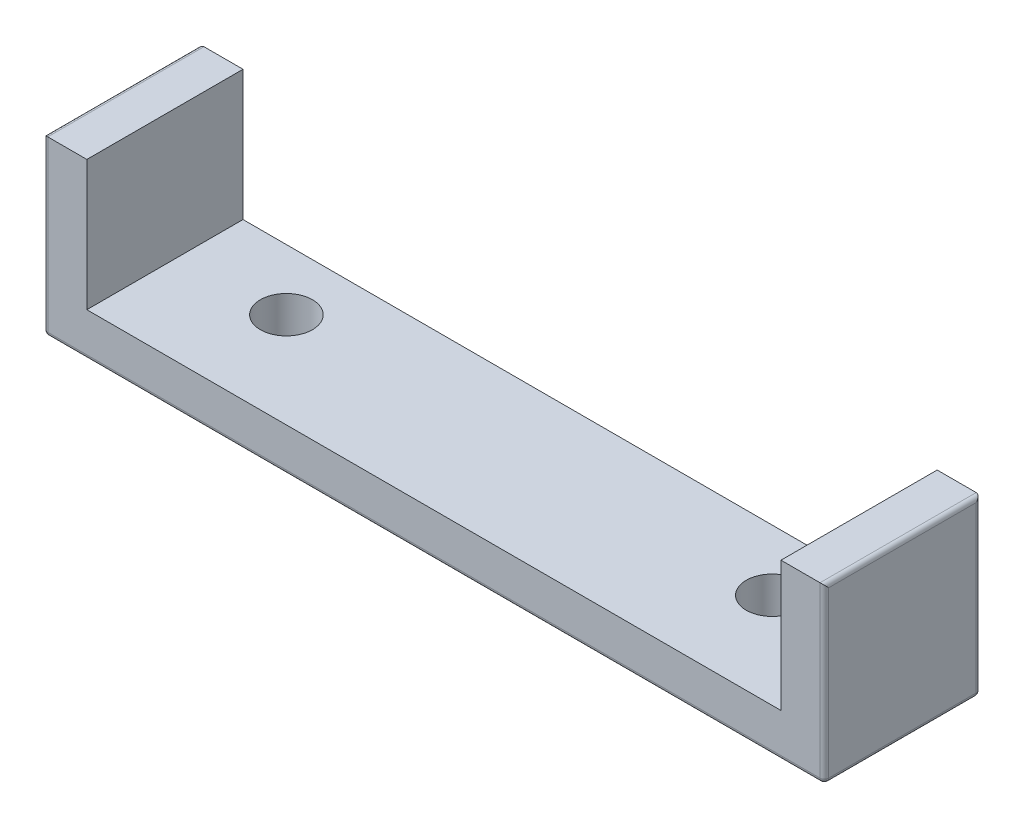
ISO-10303-21;
HEADER;
FILE_DESCRIPTION(('STEP AP214'),'2;1');
FILE_NAME('part.step','',(''),(''),'','','');
FILE_SCHEMA(('AUTOMOTIVE_DESIGN { 1 0 10303 214 1 1 1 1 }'));
ENDSEC;
DATA;
#1=APPLICATION_CONTEXT('core data for automotive mechanical design processes');
#2=APPLICATION_PROTOCOL_DEFINITION('international standard','automotive_design',2000,#1);
#3=PRODUCT_CONTEXT('',#1,'mechanical');
#4=PRODUCT('Part','Part','',(#3));
#5=PRODUCT_RELATED_PRODUCT_CATEGORY('part','',(#4));
#6=PRODUCT_DEFINITION_FORMATION('','',#4);
#7=PRODUCT_DEFINITION_CONTEXT('part definition',#1,'design');
#8=PRODUCT_DEFINITION('design','',#6,#7);
#9=PRODUCT_DEFINITION_SHAPE('','',#8);
#10=(LENGTH_UNIT() NAMED_UNIT(*) SI_UNIT(.MILLI.,.METRE.));
#11=(NAMED_UNIT(*) PLANE_ANGLE_UNIT() SI_UNIT($,.RADIAN.));
#12=(NAMED_UNIT(*) SI_UNIT($,.STERADIAN.) SOLID_ANGLE_UNIT());
#13=UNCERTAINTY_MEASURE_WITH_UNIT(LENGTH_MEASURE(1.E-05),#10,'distance_accuracy_value','');
#14=(GEOMETRIC_REPRESENTATION_CONTEXT(3) GLOBAL_UNCERTAINTY_ASSIGNED_CONTEXT((#13)) GLOBAL_UNIT_ASSIGNED_CONTEXT((#10,
#11,#12)) REPRESENTATION_CONTEXT('',''));
#15=CARTESIAN_POINT('',(0.,0.,0.));
#16=DIRECTION('',(0.,0.,1.));
#17=DIRECTION('',(1.,0.,0.));
#18=AXIS2_PLACEMENT_3D('',#15,#16,#17);
#19=CARTESIAN_POINT('',(0.,5.,0.));
#20=DIRECTION('',(0.,0.,-1.));
#21=DIRECTION('',(-1.,0.,0.));
#22=AXIS2_PLACEMENT_3D('',#19,#20,#21);
#23=PLANE('',#22);
#24=DIRECTION('',(1.,0.,0.));
#25=VECTOR('',#24,1.);
#26=CARTESIAN_POINT('',(57.5033,0.5,0.));
#27=LINE('',#26,#25);
#28=CARTESIAN_POINT('',(147.0033,0.5,0.));
#29=VERTEX_POINT('',#28);
#30=CARTESIAN_POINT('',(58.0033,0.5,0.));
#31=VERTEX_POINT('',#30);
#32=EDGE_CURVE('E200',#29,#31,#27,.F.);
#33=ORIENTED_EDGE('',*,*,#32,.T.);
#34=DIRECTION('',(0.,-1.,0.));
#35=VECTOR('',#34,1.);
#36=CARTESIAN_POINT('',(58.0033,20.,0.));
#37=LINE('',#36,#35);
#38=CARTESIAN_POINT('',(58.0033,20.,0.));
#39=VERTEX_POINT('',#38);
#40=EDGE_CURVE('E202',#31,#39,#37,.F.);
#41=ORIENTED_EDGE('',*,*,#40,.T.);
#42=DIRECTION('',(1.,0.,0.));
#43=VECTOR('',#42,1.);
#44=CARTESIAN_POINT('',(0.,20.,0.));
#45=LINE('',#44,#43);
#46=CARTESIAN_POINT('',(62.5033,20.,0.));
#47=VERTEX_POINT('',#46);
#48=EDGE_CURVE('E145',#39,#47,#45,.T.);
#49=ORIENTED_EDGE('',*,*,#48,.T.);
#50=DIRECTION('',(0.,-1.,0.));
#51=VECTOR('',#50,1.);
#52=CARTESIAN_POINT('',(62.5033,20.,0.));
#53=LINE('',#52,#51);
#54=CARTESIAN_POINT('',(62.5033,5.,0.));
#55=VERTEX_POINT('',#54);
#56=EDGE_CURVE('E171',#47,#55,#53,.T.);
#57=ORIENTED_EDGE('',*,*,#56,.T.);
#58=DIRECTION('',(1.,0.,0.));
#59=VECTOR('',#58,1.);
#60=CARTESIAN_POINT('',(0.,5.,0.));
#61=LINE('',#60,#59);
#62=CARTESIAN_POINT('',(142.5033,5.,0.));
#63=VERTEX_POINT('',#62);
#64=EDGE_CURVE('E141',#55,#63,#61,.T.);
#65=ORIENTED_EDGE('',*,*,#64,.T.);
#66=DIRECTION('',(0.,-1.,0.));
#67=VECTOR('',#66,1.);
#68=CARTESIAN_POINT('',(142.5033,20.,0.));
#69=LINE('',#68,#67);
#70=CARTESIAN_POINT('',(142.5033,20.,0.));
#71=VERTEX_POINT('',#70);
#72=EDGE_CURVE('E134',#71,#63,#69,.T.);
#73=ORIENTED_EDGE('',*,*,#72,.F.);
#74=DIRECTION('',(1.,0.,0.));
#75=VECTOR('',#74,1.);
#76=CARTESIAN_POINT('',(0.,20.,0.));
#77=LINE('',#76,#75);
#78=CARTESIAN_POINT('',(147.0033,20.,0.));
#79=VERTEX_POINT('',#78);
#80=EDGE_CURVE('E137',#71,#79,#77,.T.);
#81=ORIENTED_EDGE('',*,*,#80,.T.);
#82=DIRECTION('',(0.,-1.,0.));
#83=VECTOR('',#82,1.);
#84=CARTESIAN_POINT('',(147.0033,5.,0.));
#85=LINE('',#84,#83);
#86=EDGE_CURVE('E198',#79,#29,#85,.T.);
#87=ORIENTED_EDGE('',*,*,#86,.T.);
#88=EDGE_LOOP('',(#33,#41,#49,#57,#65,#73,#81,#87));
#89=FACE_BOUND('',#88,.T.);
#90=ADVANCED_FACE('F33',(#89),#23,.T.);
#91=CARTESIAN_POINT('',(0.,5.,18.));
#92=DIRECTION('',(0.,0.,-1.));
#93=DIRECTION('',(-1.,0.,0.));
#94=AXIS2_PLACEMENT_3D('',#91,#92,#93);
#95=PLANE('',#94);
#96=DIRECTION('',(1.,0.,0.));
#97=VECTOR('',#96,1.);
#98=CARTESIAN_POINT('',(0.,20.,18.));
#99=LINE('',#98,#97);
#100=CARTESIAN_POINT('',(58.0033,20.,18.));
#101=VERTEX_POINT('',#100);
#102=CARTESIAN_POINT('',(62.5033,20.,18.));
#103=VERTEX_POINT('',#102);
#104=EDGE_CURVE('E166',#101,#103,#99,.T.);
#105=ORIENTED_EDGE('',*,*,#104,.F.);
#106=DIRECTION('',(0.,-1.,0.));
#107=VECTOR('',#106,1.);
#108=CARTESIAN_POINT('',(58.0033,5.,18.));
#109=LINE('',#108,#107);
#110=CARTESIAN_POINT('',(58.0033,0.5,18.));
#111=VERTEX_POINT('',#110);
#112=EDGE_CURVE('E211',#101,#111,#109,.T.);
#113=ORIENTED_EDGE('',*,*,#112,.T.);
#114=DIRECTION('',(1.,0.,0.));
#115=VECTOR('',#114,1.);
#116=CARTESIAN_POINT('',(0.,0.5,18.));
#117=LINE('',#116,#115);
#118=CARTESIAN_POINT('',(147.0033,0.5,18.));
#119=VERTEX_POINT('',#118);
#120=EDGE_CURVE('E209',#111,#119,#117,.T.);
#121=ORIENTED_EDGE('',*,*,#120,.T.);
#122=DIRECTION('',(0.,-1.,0.));
#123=VECTOR('',#122,1.);
#124=CARTESIAN_POINT('',(147.0033,20.,18.));
#125=LINE('',#124,#123);
#126=CARTESIAN_POINT('',(147.0033,20.,18.));
#127=VERTEX_POINT('',#126);
#128=EDGE_CURVE('E207',#119,#127,#125,.F.);
#129=ORIENTED_EDGE('',*,*,#128,.T.);
#130=DIRECTION('',(1.,0.,0.));
#131=VECTOR('',#130,1.);
#132=CARTESIAN_POINT('',(0.,20.,18.));
#133=LINE('',#132,#131);
#134=CARTESIAN_POINT('',(142.5033,20.,18.));
#135=VERTEX_POINT('',#134);
#136=EDGE_CURVE('E155',#135,#127,#133,.T.);
#137=ORIENTED_EDGE('',*,*,#136,.F.);
#138=DIRECTION('',(0.,-1.,0.));
#139=VECTOR('',#138,1.);
#140=CARTESIAN_POINT('',(142.5033,20.,18.));
#141=LINE('',#140,#139);
#142=CARTESIAN_POINT('',(142.5033,5.,18.));
#143=VERTEX_POINT('',#142);
#144=EDGE_CURVE('E146',#135,#143,#141,.T.);
#145=ORIENTED_EDGE('',*,*,#144,.T.);
#146=DIRECTION('',(1.,0.,0.));
#147=VECTOR('',#146,1.);
#148=CARTESIAN_POINT('',(0.,5.,18.));
#149=LINE('',#148,#147);
#150=CARTESIAN_POINT('',(62.5033,5.,18.));
#151=VERTEX_POINT('',#150);
#152=EDGE_CURVE('E185',#151,#143,#149,.T.);
#153=ORIENTED_EDGE('',*,*,#152,.F.);
#154=DIRECTION('',(0.,-1.,0.));
#155=VECTOR('',#154,1.);
#156=CARTESIAN_POINT('',(62.5033,20.,18.));
#157=LINE('',#156,#155);
#158=EDGE_CURVE('E173',#103,#151,#157,.T.);
#159=ORIENTED_EDGE('',*,*,#158,.F.);
#160=EDGE_LOOP('',(#105,#113,#121,#129,#137,#145,#153,#159));
#161=FACE_BOUND('',#160,.T.);
#162=ADVANCED_FACE('F320',(#161),#95,.F.);
#163=CARTESIAN_POINT('',(74.5033,5.,7.));
#164=DIRECTION('',(0.,-1.,0.));
#165=DIRECTION('',(0.,0.,-1.));
#166=AXIS2_PLACEMENT_3D('',#163,#164,#165);
#167=CYLINDRICAL_SURFACE('',#166,3.00000000000001);
#168=CARTESIAN_POINT('',(74.5033,0.5,7.));
#169=DIRECTION('',(0.,1.,0.));
#170=DIRECTION('',(0.,0.,1.));
#171=AXIS2_PLACEMENT_3D('',#168,#169,#170);
#172=CIRCLE('',#171,3.00000000000001);
#173=CARTESIAN_POINT('',(74.5033,0.5,10.));
#174=VERTEX_POINT('',#173);
#175=EDGE_CURVE('E228',#174,#174,#172,.F.);
#176=ORIENTED_EDGE('',*,*,#175,.T.);
#177=EDGE_LOOP('',(#176));
#178=FACE_BOUND('',#177,.T.);
#179=CARTESIAN_POINT('',(74.5033,5.,7.));
#180=DIRECTION('',(0.,1.,0.));
#181=DIRECTION('',(0.,0.,1.));
#182=AXIS2_PLACEMENT_3D('',#179,#180,#181);
#183=CIRCLE('',#182,3.00000000000001);
#184=CARTESIAN_POINT('',(74.5033,5.,10.));
#185=VERTEX_POINT('',#184);
#186=EDGE_CURVE('E178',#185,#185,#183,.T.);
#187=ORIENTED_EDGE('',*,*,#186,.T.);
#188=EDGE_LOOP('',(#187));
#189=FACE_BOUND('',#188,.T.);
#190=ADVANCED_FACE('F363',(#178,#189),#167,.F.);
#191=CARTESIAN_POINT('',(130.5033,5.,7.));
#192=DIRECTION('',(0.,-1.,0.));
#193=DIRECTION('',(0.,0.,-1.));
#194=AXIS2_PLACEMENT_3D('',#191,#192,#193);
#195=CYLINDRICAL_SURFACE('',#194,2.99999999999999);
#196=CARTESIAN_POINT('',(130.5033,0.5,7.));
#197=DIRECTION('',(0.,1.,0.));
#198=DIRECTION('',(0.,0.,1.));
#199=AXIS2_PLACEMENT_3D('',#196,#197,#198);
#200=CIRCLE('',#199,2.99999999999999);
#201=CARTESIAN_POINT('',(130.5033,0.5,9.99999999999999));
#202=VERTEX_POINT('',#201);
#203=EDGE_CURVE('E231',#202,#202,#200,.F.);
#204=ORIENTED_EDGE('',*,*,#203,.T.);
#205=EDGE_LOOP('',(#204));
#206=FACE_BOUND('',#205,.T.);
#207=CARTESIAN_POINT('',(130.5033,5.,7.));
#208=DIRECTION('',(0.,1.,0.));
#209=DIRECTION('',(0.,0.,1.));
#210=AXIS2_PLACEMENT_3D('',#207,#208,#209);
#211=CIRCLE('',#210,2.99999999999999);
#212=CARTESIAN_POINT('',(130.5033,5.,9.99999999999999));
#213=VERTEX_POINT('',#212);
#214=EDGE_CURVE('E175',#213,#213,#211,.T.);
#215=ORIENTED_EDGE('',*,*,#214,.T.);
#216=EDGE_LOOP('',(#215));
#217=FACE_BOUND('',#216,.T.);
#218=ADVANCED_FACE('F369',(#206,#217),#195,.F.);
#219=CARTESIAN_POINT('',(0.,5.,0.));
#220=DIRECTION('',(0.,1.,0.));
#221=DIRECTION('',(0.,0.,1.));
#222=AXIS2_PLACEMENT_3D('',#219,#220,#221);
#223=PLANE('',#222);
#224=ORIENTED_EDGE('',*,*,#214,.F.);
#225=EDGE_LOOP('',(#224));
#226=FACE_BOUND('',#225,.T.);
#227=ORIENTED_EDGE('',*,*,#186,.F.);
#228=EDGE_LOOP('',(#227));
#229=FACE_BOUND('',#228,.T.);
#230=ORIENTED_EDGE('',*,*,#64,.F.);
#231=DIRECTION('',(0.,0.,1.));
#232=VECTOR('',#231,1.);
#233=CARTESIAN_POINT('',(62.5033,5.,0.));
#234=LINE('',#233,#232);
#235=EDGE_CURVE('E182',#55,#151,#234,.T.);
#236=ORIENTED_EDGE('',*,*,#235,.T.);
#237=ORIENTED_EDGE('',*,*,#152,.T.);
#238=DIRECTION('',(0.,0.,1.));
#239=VECTOR('',#238,1.);
#240=CARTESIAN_POINT('',(142.5033,5.,0.));
#241=LINE('',#240,#239);
#242=EDGE_CURVE('E187',#63,#143,#241,.T.);
#243=ORIENTED_EDGE('',*,*,#242,.F.);
#244=EDGE_LOOP('',(#230,#236,#237,#243));
#245=FACE_BOUND('',#244,.T.);
#246=ADVANCED_FACE('F318',(#226,#229,#245),#223,.T.);
#247=CARTESIAN_POINT('',(0.,0.,0.));
#248=DIRECTION('',(0.,1.,0.));
#249=DIRECTION('',(0.,0.,1.));
#250=AXIS2_PLACEMENT_3D('',#247,#248,#249);
#251=PLANE('',#250);
#252=CARTESIAN_POINT('',(74.5033,0.,7.));
#253=DIRECTION('',(0.,1.,0.));
#254=DIRECTION('',(0.,0.,1.));
#255=AXIS2_PLACEMENT_3D('',#252,#253,#254);
#256=CIRCLE('',#255,3.50000000000001);
#257=CARTESIAN_POINT('',(74.5033,0.,10.5));
#258=VERTEX_POINT('',#257);
#259=EDGE_CURVE('E225',#258,#258,#256,.T.);
#260=ORIENTED_EDGE('',*,*,#259,.T.);
#261=EDGE_LOOP('',(#260));
#262=FACE_BOUND('',#261,.T.);
#263=CARTESIAN_POINT('',(130.5033,0.,7.));
#264=DIRECTION('',(0.,1.,0.));
#265=DIRECTION('',(0.,0.,1.));
#266=AXIS2_PLACEMENT_3D('',#263,#264,#265);
#267=CIRCLE('',#266,3.49999999999999);
#268=CARTESIAN_POINT('',(130.5033,0.,10.5));
#269=VERTEX_POINT('',#268);
#270=EDGE_CURVE('E222',#269,#269,#267,.T.);
#271=ORIENTED_EDGE('',*,*,#270,.T.);
#272=EDGE_LOOP('',(#271));
#273=FACE_BOUND('',#272,.T.);
#274=DIRECTION('',(1.,0.,0.));
#275=VECTOR('',#274,1.);
#276=CARTESIAN_POINT('',(0.,0.,17.5));
#277=LINE('',#276,#275);
#278=CARTESIAN_POINT('',(147.0033,0.,17.5));
#279=VERTEX_POINT('',#278);
#280=CARTESIAN_POINT('',(58.0033,0.,17.5));
#281=VERTEX_POINT('',#280);
#282=EDGE_CURVE('E217',#279,#281,#277,.F.);
#283=ORIENTED_EDGE('',*,*,#282,.T.);
#284=DIRECTION('',(0.,0.,1.));
#285=VECTOR('',#284,1.);
#286=CARTESIAN_POINT('',(58.0033,0.,0.));
#287=LINE('',#286,#285);
#288=CARTESIAN_POINT('',(58.0033,0.,0.5));
#289=VERTEX_POINT('',#288);
#290=EDGE_CURVE('E219',#281,#289,#287,.F.);
#291=ORIENTED_EDGE('',*,*,#290,.T.);
#292=DIRECTION('',(1.,0.,0.));
#293=VECTOR('',#292,1.);
#294=CARTESIAN_POINT('',(147.5033,0.,0.5));
#295=LINE('',#294,#293);
#296=CARTESIAN_POINT('',(147.0033,0.,0.5));
#297=VERTEX_POINT('',#296);
#298=EDGE_CURVE('E215',#289,#297,#295,.T.);
#299=ORIENTED_EDGE('',*,*,#298,.T.);
#300=DIRECTION('',(0.,0.,1.));
#301=VECTOR('',#300,1.);
#302=CARTESIAN_POINT('',(147.0033,0.,18.));
#303=LINE('',#302,#301);
#304=EDGE_CURVE('E213',#297,#279,#303,.T.);
#305=ORIENTED_EDGE('',*,*,#304,.T.);
#306=EDGE_LOOP('',(#283,#291,#299,#305));
#307=FACE_BOUND('',#306,.T.);
#308=ADVANCED_FACE('F347',(#262,#273,#307),#251,.F.);
#309=CARTESIAN_POINT('',(62.5033,20.,0.));
#310=DIRECTION('',(1.,0.,0.));
#311=DIRECTION('',(0.,0.,-1.));
#312=AXIS2_PLACEMENT_3D('',#309,#310,#311);
#313=PLANE('',#312);
#314=ORIENTED_EDGE('',*,*,#235,.F.);
#315=ORIENTED_EDGE('',*,*,#56,.F.);
#316=DIRECTION('',(0.,0.,1.));
#317=VECTOR('',#316,1.);
#318=CARTESIAN_POINT('',(62.5033,20.,0.));
#319=LINE('',#318,#317);
#320=EDGE_CURVE('E168',#47,#103,#319,.T.);
#321=ORIENTED_EDGE('',*,*,#320,.T.);
#322=ORIENTED_EDGE('',*,*,#158,.T.);
#323=EDGE_LOOP('',(#314,#315,#321,#322));
#324=FACE_BOUND('',#323,.T.);
#325=ADVANCED_FACE('F315',(#324),#313,.T.);
#326=CARTESIAN_POINT('',(57.5033,20.,0.));
#327=DIRECTION('',(1.,0.,0.));
#328=DIRECTION('',(0.,0.,-1.));
#329=AXIS2_PLACEMENT_3D('',#326,#327,#328);
#330=PLANE('',#329);
#331=DIRECTION('',(0.,0.,1.));
#332=VECTOR('',#331,1.);
#333=CARTESIAN_POINT('',(57.5033,19.5,0.));
#334=LINE('',#333,#332);
#335=CARTESIAN_POINT('',(57.5033,19.5,17.5));
#336=VERTEX_POINT('',#335);
#337=CARTESIAN_POINT('',(57.5033,19.5,0.5));
#338=VERTEX_POINT('',#337);
#339=EDGE_CURVE('E193',#336,#338,#334,.F.);
#340=ORIENTED_EDGE('',*,*,#339,.T.);
#341=DIRECTION('',(0.,-1.,0.));
#342=VECTOR('',#341,1.);
#343=CARTESIAN_POINT('',(57.5033,0.,0.5));
#344=LINE('',#343,#342);
#345=CARTESIAN_POINT('',(57.5033,0.5,0.5));
#346=VERTEX_POINT('',#345);
#347=EDGE_CURVE('E195',#338,#346,#344,.T.);
#348=ORIENTED_EDGE('',*,*,#347,.T.);
#349=DIRECTION('',(0.,0.,1.));
#350=VECTOR('',#349,1.);
#351=CARTESIAN_POINT('',(57.5033,0.5,0.));
#352=LINE('',#351,#350);
#353=CARTESIAN_POINT('',(57.5033,0.5,17.5));
#354=VERTEX_POINT('',#353);
#355=EDGE_CURVE('E189',#346,#354,#352,.T.);
#356=ORIENTED_EDGE('',*,*,#355,.T.);
#357=DIRECTION('',(0.,-1.,0.));
#358=VECTOR('',#357,1.);
#359=CARTESIAN_POINT('',(57.5033,20.,17.5));
#360=LINE('',#359,#358);
#361=EDGE_CURVE('E191',#354,#336,#360,.F.);
#362=ORIENTED_EDGE('',*,*,#361,.T.);
#363=EDGE_LOOP('',(#340,#348,#356,#362));
#364=FACE_BOUND('',#363,.T.);
#365=ADVANCED_FACE('F339',(#364),#330,.F.);
#366=CARTESIAN_POINT('',(0.,20.,0.));
#367=DIRECTION('',(0.,1.,0.));
#368=DIRECTION('',(0.,0.,1.));
#369=AXIS2_PLACEMENT_3D('',#366,#367,#368);
#370=PLANE('',#369);
#371=ORIENTED_EDGE('',*,*,#48,.F.);
#372=DIRECTION('',(0.,0.,1.));
#373=VECTOR('',#372,1.);
#374=CARTESIAN_POINT('',(58.0033,20.,18.));
#375=LINE('',#374,#373);
#376=EDGE_CURVE('E205',#39,#101,#375,.T.);
#377=ORIENTED_EDGE('',*,*,#376,.T.);
#378=ORIENTED_EDGE('',*,*,#104,.T.);
#379=ORIENTED_EDGE('',*,*,#320,.F.);
#380=EDGE_LOOP('',(#371,#377,#378,#379));
#381=FACE_BOUND('',#380,.T.);
#382=ADVANCED_FACE('F310',(#381),#370,.T.);
#383=CARTESIAN_POINT('',(142.5033,20.,0.));
#384=DIRECTION('',(1.,0.,0.));
#385=DIRECTION('',(0.,0.,-1.));
#386=AXIS2_PLACEMENT_3D('',#383,#384,#385);
#387=PLANE('',#386);
#388=ORIENTED_EDGE('',*,*,#72,.T.);
#389=ORIENTED_EDGE('',*,*,#242,.T.);
#390=ORIENTED_EDGE('',*,*,#144,.F.);
#391=DIRECTION('',(0.,0.,1.));
#392=VECTOR('',#391,1.);
#393=CARTESIAN_POINT('',(142.5033,20.,0.));
#394=LINE('',#393,#392);
#395=EDGE_CURVE('E149',#71,#135,#394,.T.);
#396=ORIENTED_EDGE('',*,*,#395,.F.);
#397=EDGE_LOOP('',(#388,#389,#390,#396));
#398=FACE_BOUND('',#397,.T.);
#399=ADVANCED_FACE('F150',(#398),#387,.F.);
#400=CARTESIAN_POINT('',(147.5033,20.,0.));
#401=DIRECTION('',(1.,0.,0.));
#402=DIRECTION('',(0.,0.,-1.));
#403=AXIS2_PLACEMENT_3D('',#400,#401,#402);
#404=PLANE('',#403);
#405=DIRECTION('',(0.,0.,1.));
#406=VECTOR('',#405,1.);
#407=CARTESIAN_POINT('',(147.5033,19.5,0.));
#408=LINE('',#407,#406);
#409=CARTESIAN_POINT('',(147.5033,19.5,0.5));
#410=VERTEX_POINT('',#409);
#411=CARTESIAN_POINT('',(147.5033,19.5,17.5));
#412=VERTEX_POINT('',#411);
#413=EDGE_CURVE('E50',#410,#412,#408,.T.);
#414=ORIENTED_EDGE('',*,*,#413,.T.);
#415=DIRECTION('',(0.,-1.,0.));
#416=VECTOR('',#415,1.);
#417=CARTESIAN_POINT('',(147.5033,0.,17.5));
#418=LINE('',#417,#416);
#419=CARTESIAN_POINT('',(147.5033,0.5,17.5));
#420=VERTEX_POINT('',#419);
#421=EDGE_CURVE('E42',#412,#420,#418,.T.);
#422=ORIENTED_EDGE('',*,*,#421,.T.);
#423=DIRECTION('',(0.,0.,1.));
#424=VECTOR('',#423,1.);
#425=CARTESIAN_POINT('',(147.5033,0.5,0.));
#426=LINE('',#425,#424);
#427=CARTESIAN_POINT('',(147.5033,0.5,0.5));
#428=VERTEX_POINT('',#427);
#429=EDGE_CURVE('E234',#420,#428,#426,.F.);
#430=ORIENTED_EDGE('',*,*,#429,.T.);
#431=DIRECTION('',(0.,-1.,0.));
#432=VECTOR('',#431,1.);
#433=CARTESIAN_POINT('',(147.5033,20.,0.5));
#434=LINE('',#433,#432);
#435=EDGE_CURVE('E55',#428,#410,#434,.F.);
#436=ORIENTED_EDGE('',*,*,#435,.T.);
#437=EDGE_LOOP('',(#414,#422,#430,#436));
#438=FACE_BOUND('',#437,.T.);
#439=ADVANCED_FACE('F285',(#438),#404,.T.);
#440=CARTESIAN_POINT('',(0.,20.,0.));
#441=DIRECTION('',(0.,1.,0.));
#442=DIRECTION('',(0.,0.,1.));
#443=AXIS2_PLACEMENT_3D('',#440,#441,#442);
#444=PLANE('',#443);
#445=ORIENTED_EDGE('',*,*,#136,.T.);
#446=DIRECTION('',(0.,0.,1.));
#447=VECTOR('',#446,1.);
#448=CARTESIAN_POINT('',(147.0033,20.,0.));
#449=LINE('',#448,#447);
#450=EDGE_CURVE('E11',#127,#79,#449,.F.);
#451=ORIENTED_EDGE('',*,*,#450,.T.);
#452=ORIENTED_EDGE('',*,*,#80,.F.);
#453=ORIENTED_EDGE('',*,*,#395,.T.);
#454=EDGE_LOOP('',(#445,#451,#452,#453));
#455=FACE_BOUND('',#454,.T.);
#456=ADVANCED_FACE('F157',(#455),#444,.T.);
#457=CARTESIAN_POINT('',(147.0033,20.,17.5));
#458=DIRECTION('',(0.,1.,0.));
#459=DIRECTION('',(0.,0.,1.));
#460=AXIS2_PLACEMENT_3D('',#457,#458,#459);
#461=CYLINDRICAL_SURFACE('',#460,0.5);
#462=CARTESIAN_POINT('',(147.0033,0.5,17.5));
#463=DIRECTION('',(0.,-1.,0.));
#464=DIRECTION('',(0.,0.,-1.));
#465=AXIS2_PLACEMENT_3D('',#462,#463,#464);
#466=CIRCLE('',#465,0.5);
#467=EDGE_CURVE('E37',#420,#119,#466,.T.);
#468=ORIENTED_EDGE('',*,*,#467,.F.);
#469=ORIENTED_EDGE('',*,*,#421,.F.);
#470=CARTESIAN_POINT('',(147.0033,19.5,17.5));
#471=DIRECTION('',(0.,-0.707106781186547,0.707106781186547));
#472=DIRECTION('',(0.,0.707106781186547,0.707106781186547));
#473=AXIS2_PLACEMENT_3D('',#470,#471,#472);
#474=ELLIPSE('',#473,0.707106781186547,0.5);
#475=EDGE_CURVE('E161',#127,#412,#474,.F.);
#476=ORIENTED_EDGE('',*,*,#475,.F.);
#477=ORIENTED_EDGE('',*,*,#128,.F.);
#478=EDGE_LOOP('',(#468,#469,#476,#477));
#479=FACE_BOUND('',#478,.T.);
#480=ADVANCED_FACE('F284',(#479),#461,.T.);
#481=CARTESIAN_POINT('',(147.0033,0.5,17.5));
#482=DIRECTION('',(0.,0.,1.));
#483=DIRECTION('',(1.,0.,0.));
#484=AXIS2_PLACEMENT_3D('',#481,#482,#483);
#485=SPHERICAL_SURFACE('',#484,0.5);
#486=CARTESIAN_POINT('',(147.0033,0.5,17.5));
#487=DIRECTION('',(0.,0.,1.));
#488=DIRECTION('',(1.,0.,0.));
#489=AXIS2_PLACEMENT_3D('',#486,#487,#488);
#490=CIRCLE('',#489,0.5);
#491=EDGE_CURVE('E272',#420,#279,#490,.F.);
#492=ORIENTED_EDGE('',*,*,#491,.F.);
#493=ORIENTED_EDGE('',*,*,#467,.T.);
#494=CARTESIAN_POINT('',(147.0033,0.5,17.5));
#495=DIRECTION('',(1.,0.,0.));
#496=DIRECTION('',(0.,0.,-1.));
#497=AXIS2_PLACEMENT_3D('',#494,#495,#496);
#498=CIRCLE('',#497,0.5);
#499=EDGE_CURVE('E275',#279,#119,#498,.F.);
#500=ORIENTED_EDGE('',*,*,#499,.F.);
#501=EDGE_LOOP('',(#492,#493,#500));
#502=FACE_BOUND('',#501,.T.);
#503=ADVANCED_FACE('F349',(#502),#485,.T.);
#504=CARTESIAN_POINT('',(147.0033,19.5,0.));
#505=DIRECTION('',(0.,0.,1.));
#506=DIRECTION('',(1.,0.,0.));
#507=AXIS2_PLACEMENT_3D('',#504,#505,#506);
#508=CYLINDRICAL_SURFACE('',#507,0.5);
#509=ORIENTED_EDGE('',*,*,#475,.T.);
#510=ORIENTED_EDGE('',*,*,#413,.F.);
#511=CARTESIAN_POINT('',(147.0033,19.5,0.5));
#512=DIRECTION('',(0.,-0.707106781186547,-0.707106781186547));
#513=DIRECTION('',(0.,-0.707106781186547,0.707106781186547));
#514=AXIS2_PLACEMENT_3D('',#511,#512,#513);
#515=ELLIPSE('',#514,0.707106781186547,0.5);
#516=EDGE_CURVE('E269',#79,#410,#515,.T.);
#517=ORIENTED_EDGE('',*,*,#516,.F.);
#518=ORIENTED_EDGE('',*,*,#450,.F.);
#519=EDGE_LOOP('',(#509,#510,#517,#518));
#520=FACE_BOUND('',#519,.T.);
#521=ADVANCED_FACE('F280',(#520),#508,.T.);
#522=CARTESIAN_POINT('',(0.,0.5,17.5));
#523=DIRECTION('',(1.,0.,0.));
#524=DIRECTION('',(0.,0.,-1.));
#525=AXIS2_PLACEMENT_3D('',#522,#523,#524);
#526=CYLINDRICAL_SURFACE('',#525,0.5);
#527=ORIENTED_EDGE('',*,*,#499,.T.);
#528=ORIENTED_EDGE('',*,*,#120,.F.);
#529=CARTESIAN_POINT('',(58.0033,0.5,17.5));
#530=DIRECTION('',(-1.,0.,0.));
#531=DIRECTION('',(0.,0.,1.));
#532=AXIS2_PLACEMENT_3D('',#529,#530,#531);
#533=CIRCLE('',#532,0.5);
#534=EDGE_CURVE('E266',#281,#111,#533,.T.);
#535=ORIENTED_EDGE('',*,*,#534,.F.);
#536=ORIENTED_EDGE('',*,*,#282,.F.);
#537=EDGE_LOOP('',(#527,#528,#535,#536));
#538=FACE_BOUND('',#537,.T.);
#539=ADVANCED_FACE('F325',(#538),#526,.T.);
#540=CARTESIAN_POINT('',(147.0033,0.5,0.));
#541=DIRECTION('',(0.,0.,-1.));
#542=DIRECTION('',(-1.,0.,0.));
#543=AXIS2_PLACEMENT_3D('',#540,#541,#542);
#544=CYLINDRICAL_SURFACE('',#543,0.5);
#545=ORIENTED_EDGE('',*,*,#491,.T.);
#546=ORIENTED_EDGE('',*,*,#304,.F.);
#547=CARTESIAN_POINT('',(147.0033,0.5,0.5));
#548=DIRECTION('',(0.,0.,-1.));
#549=DIRECTION('',(-1.,0.,0.));
#550=AXIS2_PLACEMENT_3D('',#547,#548,#549);
#551=CIRCLE('',#550,0.5);
#552=EDGE_CURVE('E263',#428,#297,#551,.T.);
#553=ORIENTED_EDGE('',*,*,#552,.F.);
#554=ORIENTED_EDGE('',*,*,#429,.F.);
#555=EDGE_LOOP('',(#545,#546,#553,#554));
#556=FACE_BOUND('',#555,.T.);
#557=ADVANCED_FACE('F295',(#556),#544,.T.);
#558=CARTESIAN_POINT('',(147.0033,5.,0.5));
#559=DIRECTION('',(0.,-1.,0.));
#560=DIRECTION('',(0.,0.,-1.));
#561=AXIS2_PLACEMENT_3D('',#558,#559,#560);
#562=CYLINDRICAL_SURFACE('',#561,0.5);
#563=ORIENTED_EDGE('',*,*,#516,.T.);
#564=ORIENTED_EDGE('',*,*,#435,.F.);
#565=CARTESIAN_POINT('',(147.0033,0.5,0.5));
#566=DIRECTION('',(0.,-1.,0.));
#567=DIRECTION('',(0.,0.,-1.));
#568=AXIS2_PLACEMENT_3D('',#565,#566,#567);
#569=CIRCLE('',#568,0.5);
#570=EDGE_CURVE('E260',#29,#428,#569,.T.);
#571=ORIENTED_EDGE('',*,*,#570,.F.);
#572=ORIENTED_EDGE('',*,*,#86,.F.);
#573=EDGE_LOOP('',(#563,#564,#571,#572));
#574=FACE_BOUND('',#573,.T.);
#575=ADVANCED_FACE('F291',(#574),#562,.T.);
#576=CARTESIAN_POINT('',(58.0033,0.5,17.5));
#577=DIRECTION('',(0.,0.,1.));
#578=DIRECTION('',(1.,0.,0.));
#579=AXIS2_PLACEMENT_3D('',#576,#577,#578);
#580=SPHERICAL_SURFACE('',#579,0.5);
#581=CARTESIAN_POINT('',(58.0033,0.5,17.5));
#582=DIRECTION('',(0.,0.,1.));
#583=DIRECTION('',(1.,0.,0.));
#584=AXIS2_PLACEMENT_3D('',#581,#582,#583);
#585=CIRCLE('',#584,0.5);
#586=EDGE_CURVE('E254',#281,#354,#585,.F.);
#587=ORIENTED_EDGE('',*,*,#586,.F.);
#588=ORIENTED_EDGE('',*,*,#534,.T.);
#589=CARTESIAN_POINT('',(58.0033,0.5,17.5));
#590=DIRECTION('',(0.,-1.,0.));
#591=DIRECTION('',(1.,0.,0.));
#592=AXIS2_PLACEMENT_3D('',#589,#590,#591);
#593=CIRCLE('',#592,0.5);
#594=EDGE_CURVE('E257',#354,#111,#593,.F.);
#595=ORIENTED_EDGE('',*,*,#594,.F.);
#596=EDGE_LOOP('',(#587,#588,#595));
#597=FACE_BOUND('',#596,.T.);
#598=ADVANCED_FACE('F331',(#597),#580,.T.);
#599=CARTESIAN_POINT('',(147.0033,0.5,0.5));
#600=DIRECTION('',(0.,0.,1.));
#601=DIRECTION('',(1.,0.,0.));
#602=AXIS2_PLACEMENT_3D('',#599,#600,#601);
#603=SPHERICAL_SURFACE('',#602,0.5);
#604=ORIENTED_EDGE('',*,*,#570,.T.);
#605=ORIENTED_EDGE('',*,*,#552,.T.);
#606=CARTESIAN_POINT('',(147.0033,0.5,0.5));
#607=DIRECTION('',(1.,0.,0.));
#608=DIRECTION('',(0.,0.,-1.));
#609=AXIS2_PLACEMENT_3D('',#606,#607,#608);
#610=CIRCLE('',#609,0.5);
#611=EDGE_CURVE('E251',#29,#297,#610,.F.);
#612=ORIENTED_EDGE('',*,*,#611,.F.);
#613=EDGE_LOOP('',(#604,#605,#612));
#614=FACE_BOUND('',#613,.T.);
#615=ADVANCED_FACE('F297',(#614),#603,.T.);
#616=CARTESIAN_POINT('',(58.0033,5.,17.5));
#617=DIRECTION('',(0.,-1.,0.));
#618=DIRECTION('',(0.,0.,-1.));
#619=AXIS2_PLACEMENT_3D('',#616,#617,#618);
#620=CYLINDRICAL_SURFACE('',#619,0.5);
#621=ORIENTED_EDGE('',*,*,#594,.T.);
#622=ORIENTED_EDGE('',*,*,#112,.F.);
#623=CARTESIAN_POINT('',(58.0033,19.5,17.5));
#624=DIRECTION('',(0.,-0.707106781186547,0.707106781186547));
#625=DIRECTION('',(0.,-0.707106781186547,-0.707106781186547));
#626=AXIS2_PLACEMENT_3D('',#623,#624,#625);
#627=ELLIPSE('',#626,0.707106781186547,0.5);
#628=EDGE_CURVE('E248',#336,#101,#627,.F.);
#629=ORIENTED_EDGE('',*,*,#628,.F.);
#630=ORIENTED_EDGE('',*,*,#361,.F.);
#631=EDGE_LOOP('',(#621,#622,#629,#630));
#632=FACE_BOUND('',#631,.T.);
#633=ADVANCED_FACE('F335',(#632),#620,.T.);
#634=CARTESIAN_POINT('',(58.0033,0.5,0.));
#635=DIRECTION('',(0.,0.,1.));
#636=DIRECTION('',(1.,0.,0.));
#637=AXIS2_PLACEMENT_3D('',#634,#635,#636);
#638=CYLINDRICAL_SURFACE('',#637,0.5);
#639=ORIENTED_EDGE('',*,*,#586,.T.);
#640=ORIENTED_EDGE('',*,*,#355,.F.);
#641=CARTESIAN_POINT('',(58.0033,0.5,0.5));
#642=DIRECTION('',(0.,0.,-1.));
#643=DIRECTION('',(-1.,0.,0.));
#644=AXIS2_PLACEMENT_3D('',#641,#642,#643);
#645=CIRCLE('',#644,0.5);
#646=EDGE_CURVE('E245',#289,#346,#645,.T.);
#647=ORIENTED_EDGE('',*,*,#646,.F.);
#648=ORIENTED_EDGE('',*,*,#290,.F.);
#649=EDGE_LOOP('',(#639,#640,#647,#648));
#650=FACE_BOUND('',#649,.T.);
#651=ADVANCED_FACE('F345',(#650),#638,.T.);
#652=CARTESIAN_POINT('',(0.,0.5,0.5));
#653=DIRECTION('',(-1.,0.,0.));
#654=DIRECTION('',(0.,0.,1.));
#655=AXIS2_PLACEMENT_3D('',#652,#653,#654);
#656=CYLINDRICAL_SURFACE('',#655,0.5);
#657=ORIENTED_EDGE('',*,*,#611,.T.);
#658=ORIENTED_EDGE('',*,*,#298,.F.);
#659=CARTESIAN_POINT('',(58.0033,0.5,0.5));
#660=DIRECTION('',(-1.,0.,0.));
#661=DIRECTION('',(0.,0.,1.));
#662=AXIS2_PLACEMENT_3D('',#659,#660,#661);
#663=CIRCLE('',#662,0.5);
#664=EDGE_CURVE('E243',#31,#289,#663,.T.);
#665=ORIENTED_EDGE('',*,*,#664,.F.);
#666=ORIENTED_EDGE('',*,*,#32,.F.);
#667=EDGE_LOOP('',(#657,#658,#665,#666));
#668=FACE_BOUND('',#667,.T.);
#669=ADVANCED_FACE('F302',(#668),#656,.T.);
#670=CARTESIAN_POINT('',(58.0033,19.5,0.));
#671=DIRECTION('',(0.,0.,-1.));
#672=DIRECTION('',(-1.,0.,0.));
#673=AXIS2_PLACEMENT_3D('',#670,#671,#672);
#674=CYLINDRICAL_SURFACE('',#673,0.5);
#675=ORIENTED_EDGE('',*,*,#628,.T.);
#676=ORIENTED_EDGE('',*,*,#376,.F.);
#677=CARTESIAN_POINT('',(58.0033,19.5,0.5));
#678=DIRECTION('',(0.,-0.707106781186547,-0.707106781186547));
#679=DIRECTION('',(0.,0.707106781186547,-0.707106781186547));
#680=AXIS2_PLACEMENT_3D('',#677,#678,#679);
#681=ELLIPSE('',#680,0.707106781186547,0.5);
#682=EDGE_CURVE('E241',#338,#39,#681,.T.);
#683=ORIENTED_EDGE('',*,*,#682,.F.);
#684=ORIENTED_EDGE('',*,*,#339,.F.);
#685=EDGE_LOOP('',(#675,#676,#683,#684));
#686=FACE_BOUND('',#685,.T.);
#687=ADVANCED_FACE('F381',(#686),#674,.T.);
#688=CARTESIAN_POINT('',(58.0033,0.5,0.5));
#689=DIRECTION('',(0.,0.,1.));
#690=DIRECTION('',(1.,0.,0.));
#691=AXIS2_PLACEMENT_3D('',#688,#689,#690);
#692=SPHERICAL_SURFACE('',#691,0.5);
#693=ORIENTED_EDGE('',*,*,#664,.T.);
#694=ORIENTED_EDGE('',*,*,#646,.T.);
#695=CARTESIAN_POINT('',(58.0033,0.5,0.5));
#696=DIRECTION('',(0.,-1.,0.));
#697=DIRECTION('',(0.,0.,-1.));
#698=AXIS2_PLACEMENT_3D('',#695,#696,#697);
#699=CIRCLE('',#698,0.5);
#700=EDGE_CURVE('E239',#31,#346,#699,.F.);
#701=ORIENTED_EDGE('',*,*,#700,.F.);
#702=EDGE_LOOP('',(#693,#694,#701));
#703=FACE_BOUND('',#702,.T.);
#704=ADVANCED_FACE('F378',(#703),#692,.T.);
#705=CARTESIAN_POINT('',(58.0033,20.,0.5));
#706=DIRECTION('',(0.,1.,0.));
#707=DIRECTION('',(0.,0.,1.));
#708=AXIS2_PLACEMENT_3D('',#705,#706,#707);
#709=CYLINDRICAL_SURFACE('',#708,0.5);
#710=ORIENTED_EDGE('',*,*,#682,.T.);
#711=ORIENTED_EDGE('',*,*,#40,.F.);
#712=ORIENTED_EDGE('',*,*,#700,.T.);
#713=ORIENTED_EDGE('',*,*,#347,.F.);
#714=EDGE_LOOP('',(#710,#711,#712,#713));
#715=FACE_BOUND('',#714,.T.);
#716=ADVANCED_FACE('F374',(#715),#709,.T.);
#717=CARTESIAN_POINT('',(74.5033,0.5,7.));
#718=DIRECTION('',(0.,1.,0.));
#719=DIRECTION('',(0.,0.,1.));
#720=AXIS2_PLACEMENT_3D('',#717,#718,#719);
#721=TOROIDAL_SURFACE('',#720,3.50000000000001,0.5);
#722=ORIENTED_EDGE('',*,*,#175,.F.);
#723=EDGE_LOOP('',(#722));
#724=FACE_BOUND('',#723,.T.);
#725=ORIENTED_EDGE('',*,*,#259,.F.);
#726=EDGE_LOOP('',(#725));
#727=FACE_BOUND('',#726,.T.);
#728=ADVANCED_FACE('F377',(#724,#727),#721,.T.);
#729=CARTESIAN_POINT('',(130.5033,0.5,7.));
#730=DIRECTION('',(0.,1.,0.));
#731=DIRECTION('',(0.,0.,1.));
#732=AXIS2_PLACEMENT_3D('',#729,#730,#731);
#733=TOROIDAL_SURFACE('',#732,3.49999999999999,0.5);
#734=ORIENTED_EDGE('',*,*,#203,.F.);
#735=EDGE_LOOP('',(#734));
#736=FACE_BOUND('',#735,.T.);
#737=ORIENTED_EDGE('',*,*,#270,.F.);
#738=EDGE_LOOP('',(#737));
#739=FACE_BOUND('',#738,.T.);
#740=ADVANCED_FACE('F35',(#736,#739),#733,.T.);
#741=CLOSED_SHELL('',(#90,#162,#190,#218,#246,#308,#325,#365,#382,#399,#439,#456,#480,#503,#521,
#539,#557,#575,#598,#615,#633,#651,#669,#687,#704,#716,#728,#740));
#742=MANIFOLD_SOLID_BREP('B2',#741);
#743=ADVANCED_BREP_SHAPE_REPRESENTATION('',(#18,#742),#14);
#744=SHAPE_DEFINITION_REPRESENTATION(#9,#743);
ENDSEC;
END-ISO-10303-21;
